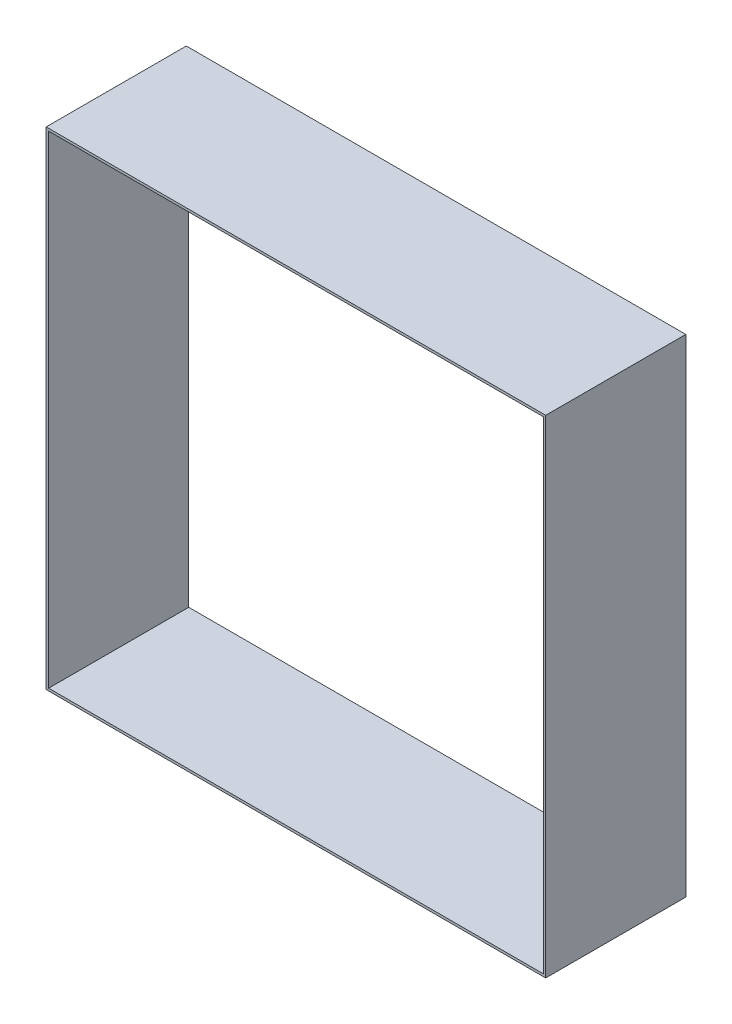
ISO-10303-21;
HEADER;
FILE_DESCRIPTION(('STEP AP214'),'2;1');
FILE_NAME('part.step','',(''),(''),'','','');
FILE_SCHEMA(('AUTOMOTIVE_DESIGN { 1 0 10303 214 1 1 1 1 }'));
ENDSEC;
DATA;
#1=APPLICATION_CONTEXT('core data for automotive mechanical design processes');
#2=APPLICATION_PROTOCOL_DEFINITION('international standard','automotive_design',2000,#1);
#3=PRODUCT_CONTEXT('',#1,'mechanical');
#4=PRODUCT('Part','Part','',(#3));
#5=PRODUCT_RELATED_PRODUCT_CATEGORY('part','',(#4));
#6=PRODUCT_DEFINITION_FORMATION('','',#4);
#7=PRODUCT_DEFINITION_CONTEXT('part definition',#1,'design');
#8=PRODUCT_DEFINITION('design','',#6,#7);
#9=PRODUCT_DEFINITION_SHAPE('','',#8);
#10=(LENGTH_UNIT() NAMED_UNIT(*) SI_UNIT(.MILLI.,.METRE.));
#11=(NAMED_UNIT(*) PLANE_ANGLE_UNIT() SI_UNIT($,.RADIAN.));
#12=(NAMED_UNIT(*) SI_UNIT($,.STERADIAN.) SOLID_ANGLE_UNIT());
#13=UNCERTAINTY_MEASURE_WITH_UNIT(LENGTH_MEASURE(1.E-05),#10,'distance_accuracy_value','');
#14=(GEOMETRIC_REPRESENTATION_CONTEXT(3) GLOBAL_UNCERTAINTY_ASSIGNED_CONTEXT((#13)) GLOBAL_UNIT_ASSIGNED_CONTEXT((#10,
#11,#12)) REPRESENTATION_CONTEXT('',''));
#15=CARTESIAN_POINT('',(0.,0.,0.));
#16=DIRECTION('',(0.,0.,1.));
#17=DIRECTION('',(1.,0.,0.));
#18=AXIS2_PLACEMENT_3D('',#15,#16,#17);
#19=CARTESIAN_POINT('',(0.,0.,11.5));
#20=DIRECTION('',(0.,0.,-1.));
#21=DIRECTION('',(-1.,0.,0.));
#22=AXIS2_PLACEMENT_3D('',#19,#20,#21);
#23=PLANE('',#22);
#24=DIRECTION('',(0.,-1.,0.));
#25=VECTOR('',#24,1.);
#26=CARTESIAN_POINT('',(0.,0.,11.5));
#27=LINE('',#26,#25);
#28=CARTESIAN_POINT('',(0.,40.,11.5));
#29=VERTEX_POINT('',#28);
#30=CARTESIAN_POINT('',(0.,0.,11.5));
#31=VERTEX_POINT('',#30);
#32=EDGE_CURVE('E153',#29,#31,#27,.T.);
#33=ORIENTED_EDGE('',*,*,#32,.T.);
#34=DIRECTION('',(1.,0.,0.));
#35=VECTOR('',#34,1.);
#36=CARTESIAN_POINT('',(0.,0.,11.5));
#37=LINE('',#36,#35);
#38=CARTESIAN_POINT('',(41.,0.,11.5));
#39=VERTEX_POINT('',#38);
#40=EDGE_CURVE('E157',#31,#39,#37,.T.);
#41=ORIENTED_EDGE('',*,*,#40,.T.);
#42=DIRECTION('',(0.,1.,0.));
#43=VECTOR('',#42,1.);
#44=CARTESIAN_POINT('',(41.,0.,11.5));
#45=LINE('',#44,#43);
#46=CARTESIAN_POINT('',(41.,40.,11.5));
#47=VERTEX_POINT('',#46);
#48=EDGE_CURVE('E161',#39,#47,#45,.T.);
#49=ORIENTED_EDGE('',*,*,#48,.T.);
#50=DIRECTION('',(-1.,0.,0.));
#51=VECTOR('',#50,1.);
#52=CARTESIAN_POINT('',(0.,40.,11.5));
#53=LINE('',#52,#51);
#54=EDGE_CURVE('E164',#47,#29,#53,.T.);
#55=ORIENTED_EDGE('',*,*,#54,.T.);
#56=EDGE_LOOP('',(#33,#41,#49,#55));
#57=FACE_BOUND('',#56,.T.);
#58=DIRECTION('',(0.,-1.,0.));
#59=VECTOR('',#58,1.);
#60=CARTESIAN_POINT('',(0.2,0.2,11.5));
#61=LINE('',#60,#59);
#62=CARTESIAN_POINT('',(0.2,39.8,11.5));
#63=VERTEX_POINT('',#62);
#64=CARTESIAN_POINT('',(0.2,0.2,11.5));
#65=VERTEX_POINT('',#64);
#66=EDGE_CURVE('E105',#63,#65,#61,.T.);
#67=ORIENTED_EDGE('',*,*,#66,.F.);
#68=DIRECTION('',(-1.,0.,0.));
#69=VECTOR('',#68,1.);
#70=CARTESIAN_POINT('',(0.2,39.8,11.5));
#71=LINE('',#70,#69);
#72=CARTESIAN_POINT('',(40.8,39.8,11.5));
#73=VERTEX_POINT('',#72);
#74=EDGE_CURVE('E131',#73,#63,#71,.T.);
#75=ORIENTED_EDGE('',*,*,#74,.F.);
#76=DIRECTION('',(0.,1.,0.));
#77=VECTOR('',#76,1.);
#78=CARTESIAN_POINT('',(40.8,0.2,11.5));
#79=LINE('',#78,#77);
#80=CARTESIAN_POINT('',(40.8,0.2,11.5));
#81=VERTEX_POINT('',#80);
#82=EDGE_CURVE('E127',#81,#73,#79,.T.);
#83=ORIENTED_EDGE('',*,*,#82,.F.);
#84=DIRECTION('',(1.,0.,0.));
#85=VECTOR('',#84,1.);
#86=CARTESIAN_POINT('',(0.2,0.2,11.5));
#87=LINE('',#86,#85);
#88=EDGE_CURVE('E114',#65,#81,#87,.T.);
#89=ORIENTED_EDGE('',*,*,#88,.F.);
#90=EDGE_LOOP('',(#67,#75,#83,#89));
#91=FACE_BOUND('',#90,.T.);
#92=ADVANCED_FACE('F39',(#57,#91),#23,.F.);
#93=CARTESIAN_POINT('',(0.,0.,0.));
#94=DIRECTION('',(0.,0.,-1.));
#95=DIRECTION('',(-1.,0.,0.));
#96=AXIS2_PLACEMENT_3D('',#93,#94,#95);
#97=PLANE('',#96);
#98=DIRECTION('',(0.,-1.,0.));
#99=VECTOR('',#98,1.);
#100=CARTESIAN_POINT('',(0.,0.,0.));
#101=LINE('',#100,#99);
#102=CARTESIAN_POINT('',(0.,40.,0.));
#103=VERTEX_POINT('',#102);
#104=CARTESIAN_POINT('',(0.,0.,0.));
#105=VERTEX_POINT('',#104);
#106=EDGE_CURVE('E123',#103,#105,#101,.T.);
#107=ORIENTED_EDGE('',*,*,#106,.F.);
#108=DIRECTION('',(-1.,0.,0.));
#109=VECTOR('',#108,1.);
#110=CARTESIAN_POINT('',(0.,40.,0.));
#111=LINE('',#110,#109);
#112=CARTESIAN_POINT('',(41.,40.,0.));
#113=VERTEX_POINT('',#112);
#114=EDGE_CURVE('E158',#113,#103,#111,.T.);
#115=ORIENTED_EDGE('',*,*,#114,.F.);
#116=DIRECTION('',(0.,1.,0.));
#117=VECTOR('',#116,1.);
#118=CARTESIAN_POINT('',(41.,0.,0.));
#119=LINE('',#118,#117);
#120=CARTESIAN_POINT('',(41.,0.,0.));
#121=VERTEX_POINT('',#120);
#122=EDGE_CURVE('E174',#121,#113,#119,.T.);
#123=ORIENTED_EDGE('',*,*,#122,.F.);
#124=DIRECTION('',(1.,0.,0.));
#125=VECTOR('',#124,1.);
#126=CARTESIAN_POINT('',(0.,0.,0.));
#127=LINE('',#126,#125);
#128=EDGE_CURVE('E171',#105,#121,#127,.T.);
#129=ORIENTED_EDGE('',*,*,#128,.F.);
#130=EDGE_LOOP('',(#107,#115,#123,#129));
#131=FACE_BOUND('',#130,.T.);
#132=DIRECTION('',(-1.,0.,0.));
#133=VECTOR('',#132,1.);
#134=CARTESIAN_POINT('',(0.2,39.8,0.));
#135=LINE('',#134,#133);
#136=CARTESIAN_POINT('',(40.8,39.8,0.));
#137=VERTEX_POINT('',#136);
#138=CARTESIAN_POINT('',(0.2,39.8,0.));
#139=VERTEX_POINT('',#138);
#140=EDGE_CURVE('E115',#137,#139,#135,.T.);
#141=ORIENTED_EDGE('',*,*,#140,.T.);
#142=DIRECTION('',(0.,-1.,0.));
#143=VECTOR('',#142,1.);
#144=CARTESIAN_POINT('',(0.2,0.2,0.));
#145=LINE('',#144,#143);
#146=CARTESIAN_POINT('',(0.2,0.2,0.));
#147=VERTEX_POINT('',#146);
#148=EDGE_CURVE('E63',#139,#147,#145,.T.);
#149=ORIENTED_EDGE('',*,*,#148,.T.);
#150=DIRECTION('',(1.,0.,0.));
#151=VECTOR('',#150,1.);
#152=CARTESIAN_POINT('',(0.2,0.2,0.));
#153=LINE('',#152,#151);
#154=CARTESIAN_POINT('',(40.8,0.2,0.));
#155=VERTEX_POINT('',#154);
#156=EDGE_CURVE('E121',#147,#155,#153,.T.);
#157=ORIENTED_EDGE('',*,*,#156,.T.);
#158=DIRECTION('',(0.,1.,0.));
#159=VECTOR('',#158,1.);
#160=CARTESIAN_POINT('',(40.8,0.2,0.));
#161=LINE('',#160,#159);
#162=EDGE_CURVE('E140',#155,#137,#161,.T.);
#163=ORIENTED_EDGE('',*,*,#162,.T.);
#164=EDGE_LOOP('',(#141,#149,#157,#163));
#165=FACE_BOUND('',#164,.T.);
#166=ADVANCED_FACE('F197',(#131,#165),#97,.T.);
#167=CARTESIAN_POINT('',(0.,0.,11.5));
#168=DIRECTION('',(1.,0.,0.));
#169=DIRECTION('',(0.,0.,-1.));
#170=AXIS2_PLACEMENT_3D('',#167,#168,#169);
#171=PLANE('',#170);
#172=ORIENTED_EDGE('',*,*,#106,.T.);
#173=DIRECTION('',(0.,0.,-1.));
#174=VECTOR('',#173,1.);
#175=CARTESIAN_POINT('',(0.,0.,11.5));
#176=LINE('',#175,#174);
#177=EDGE_CURVE('E11',#31,#105,#176,.T.);
#178=ORIENTED_EDGE('',*,*,#177,.F.);
#179=ORIENTED_EDGE('',*,*,#32,.F.);
#180=DIRECTION('',(0.,0.,-1.));
#181=VECTOR('',#180,1.);
#182=CARTESIAN_POINT('',(0.,40.,11.5));
#183=LINE('',#182,#181);
#184=EDGE_CURVE('E167',#29,#103,#183,.T.);
#185=ORIENTED_EDGE('',*,*,#184,.T.);
#186=EDGE_LOOP('',(#172,#178,#179,#185));
#187=FACE_BOUND('',#186,.T.);
#188=ADVANCED_FACE('F41',(#187),#171,.F.);
#189=CARTESIAN_POINT('',(0.,0.,11.5));
#190=DIRECTION('',(0.,1.,0.));
#191=DIRECTION('',(0.,0.,1.));
#192=AXIS2_PLACEMENT_3D('',#189,#190,#191);
#193=PLANE('',#192);
#194=ORIENTED_EDGE('',*,*,#128,.T.);
#195=DIRECTION('',(0.,0.,-1.));
#196=VECTOR('',#195,1.);
#197=CARTESIAN_POINT('',(41.,0.,11.5));
#198=LINE('',#197,#196);
#199=EDGE_CURVE('E48',#39,#121,#198,.T.);
#200=ORIENTED_EDGE('',*,*,#199,.F.);
#201=ORIENTED_EDGE('',*,*,#40,.F.);
#202=ORIENTED_EDGE('',*,*,#177,.T.);
#203=EDGE_LOOP('',(#194,#200,#201,#202));
#204=FACE_BOUND('',#203,.T.);
#205=ADVANCED_FACE('F207',(#204),#193,.F.);
#206=CARTESIAN_POINT('',(41.,0.,11.5));
#207=DIRECTION('',(-1.,0.,0.));
#208=DIRECTION('',(0.,0.,1.));
#209=AXIS2_PLACEMENT_3D('',#206,#207,#208);
#210=PLANE('',#209);
#211=ORIENTED_EDGE('',*,*,#122,.T.);
#212=DIRECTION('',(0.,0.,-1.));
#213=VECTOR('',#212,1.);
#214=CARTESIAN_POINT('',(41.,40.,11.5));
#215=LINE('',#214,#213);
#216=EDGE_CURVE('E182',#47,#113,#215,.T.);
#217=ORIENTED_EDGE('',*,*,#216,.F.);
#218=ORIENTED_EDGE('',*,*,#48,.F.);
#219=ORIENTED_EDGE('',*,*,#199,.T.);
#220=EDGE_LOOP('',(#211,#217,#218,#219));
#221=FACE_BOUND('',#220,.T.);
#222=ADVANCED_FACE('F191',(#221),#210,.F.);
#223=CARTESIAN_POINT('',(0.,40.,11.5));
#224=DIRECTION('',(0.,-1.,0.));
#225=DIRECTION('',(0.,0.,-1.));
#226=AXIS2_PLACEMENT_3D('',#223,#224,#225);
#227=PLANE('',#226);
#228=ORIENTED_EDGE('',*,*,#114,.T.);
#229=ORIENTED_EDGE('',*,*,#184,.F.);
#230=ORIENTED_EDGE('',*,*,#54,.F.);
#231=ORIENTED_EDGE('',*,*,#216,.T.);
#232=EDGE_LOOP('',(#228,#229,#230,#231));
#233=FACE_BOUND('',#232,.T.);
#234=ADVANCED_FACE('F201',(#233),#227,.F.);
#235=CARTESIAN_POINT('',(0.2,0.2,11.5));
#236=DIRECTION('',(1.,0.,0.));
#237=DIRECTION('',(0.,0.,-1.));
#238=AXIS2_PLACEMENT_3D('',#235,#236,#237);
#239=PLANE('',#238);
#240=ORIENTED_EDGE('',*,*,#148,.F.);
#241=DIRECTION('',(0.,0.,-1.));
#242=VECTOR('',#241,1.);
#243=CARTESIAN_POINT('',(0.2,39.8,11.5));
#244=LINE('',#243,#242);
#245=EDGE_CURVE('E109',#63,#139,#244,.T.);
#246=ORIENTED_EDGE('',*,*,#245,.F.);
#247=ORIENTED_EDGE('',*,*,#66,.T.);
#248=DIRECTION('',(0.,0.,-1.));
#249=VECTOR('',#248,1.);
#250=CARTESIAN_POINT('',(0.2,0.2,11.5));
#251=LINE('',#250,#249);
#252=EDGE_CURVE('E108',#65,#147,#251,.T.);
#253=ORIENTED_EDGE('',*,*,#252,.T.);
#254=EDGE_LOOP('',(#240,#246,#247,#253));
#255=FACE_BOUND('',#254,.T.);
#256=ADVANCED_FACE('F107',(#255),#239,.T.);
#257=CARTESIAN_POINT('',(0.2,0.2,11.5));
#258=DIRECTION('',(0.,1.,0.));
#259=DIRECTION('',(0.,0.,1.));
#260=AXIS2_PLACEMENT_3D('',#257,#258,#259);
#261=PLANE('',#260);
#262=ORIENTED_EDGE('',*,*,#156,.F.);
#263=ORIENTED_EDGE('',*,*,#252,.F.);
#264=ORIENTED_EDGE('',*,*,#88,.T.);
#265=DIRECTION('',(0.,0.,-1.));
#266=VECTOR('',#265,1.);
#267=CARTESIAN_POINT('',(40.8,0.2,11.5));
#268=LINE('',#267,#266);
#269=EDGE_CURVE('E124',#81,#155,#268,.T.);
#270=ORIENTED_EDGE('',*,*,#269,.T.);
#271=EDGE_LOOP('',(#262,#263,#264,#270));
#272=FACE_BOUND('',#271,.T.);
#273=ADVANCED_FACE('F118',(#272),#261,.T.);
#274=CARTESIAN_POINT('',(40.8,0.2,11.5));
#275=DIRECTION('',(-1.,0.,0.));
#276=DIRECTION('',(0.,0.,1.));
#277=AXIS2_PLACEMENT_3D('',#274,#275,#276);
#278=PLANE('',#277);
#279=ORIENTED_EDGE('',*,*,#162,.F.);
#280=ORIENTED_EDGE('',*,*,#269,.F.);
#281=ORIENTED_EDGE('',*,*,#82,.T.);
#282=DIRECTION('',(0.,0.,-1.));
#283=VECTOR('',#282,1.);
#284=CARTESIAN_POINT('',(40.8,39.8,11.5));
#285=LINE('',#284,#283);
#286=EDGE_CURVE('E55',#73,#137,#285,.T.);
#287=ORIENTED_EDGE('',*,*,#286,.T.);
#288=EDGE_LOOP('',(#279,#280,#281,#287));
#289=FACE_BOUND('',#288,.T.);
#290=ADVANCED_FACE('F230',(#289),#278,.T.);
#291=CARTESIAN_POINT('',(0.2,39.8,11.5));
#292=DIRECTION('',(0.,-1.,0.));
#293=DIRECTION('',(0.,0.,-1.));
#294=AXIS2_PLACEMENT_3D('',#291,#292,#293);
#295=PLANE('',#294);
#296=ORIENTED_EDGE('',*,*,#140,.F.);
#297=ORIENTED_EDGE('',*,*,#286,.F.);
#298=ORIENTED_EDGE('',*,*,#74,.T.);
#299=ORIENTED_EDGE('',*,*,#245,.T.);
#300=EDGE_LOOP('',(#296,#297,#298,#299));
#301=FACE_BOUND('',#300,.T.);
#302=ADVANCED_FACE('F234',(#301),#295,.T.);
#303=CLOSED_SHELL('',(#92,#166,#188,#205,#222,#234,#256,#273,#290,#302));
#304=MANIFOLD_SOLID_BREP('B2',#303);
#305=ADVANCED_BREP_SHAPE_REPRESENTATION('',(#18,#304),#14);
#306=SHAPE_DEFINITION_REPRESENTATION(#9,#305);
ENDSEC;
END-ISO-10303-21;
